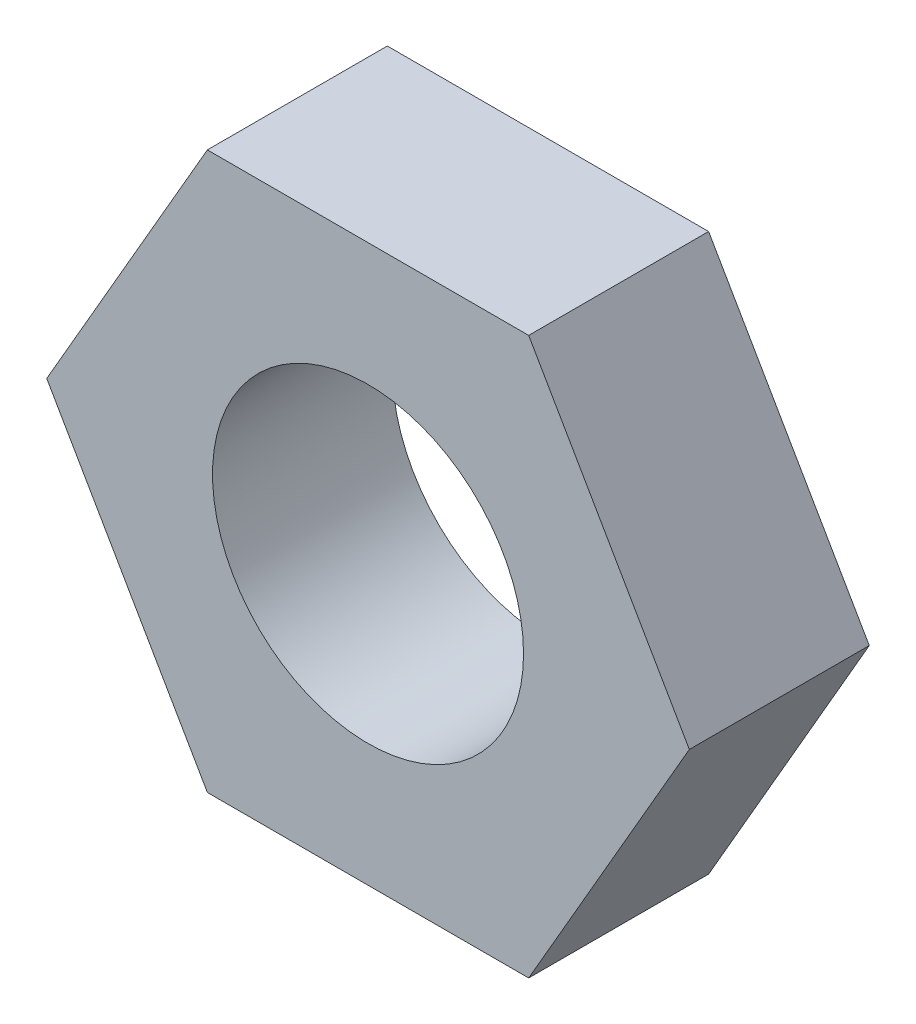
ISO-10303-21;
HEADER;
FILE_DESCRIPTION(('STEP AP214'),'2;1');
FILE_NAME('part.step','',(''),(''),'','','');
FILE_SCHEMA(('AUTOMOTIVE_DESIGN { 1 0 10303 214 1 1 1 1 }'));
ENDSEC;
DATA;
#1=APPLICATION_CONTEXT('core data for automotive mechanical design processes');
#2=APPLICATION_PROTOCOL_DEFINITION('international standard','automotive_design',2000,#1);
#3=PRODUCT_CONTEXT('',#1,'mechanical');
#4=PRODUCT('Part','Part','',(#3));
#5=PRODUCT_RELATED_PRODUCT_CATEGORY('part','',(#4));
#6=PRODUCT_DEFINITION_FORMATION('','',#4);
#7=PRODUCT_DEFINITION_CONTEXT('part definition',#1,'design');
#8=PRODUCT_DEFINITION('design','',#6,#7);
#9=PRODUCT_DEFINITION_SHAPE('','',#8);
#10=(LENGTH_UNIT() NAMED_UNIT(*) SI_UNIT(.MILLI.,.METRE.));
#11=(NAMED_UNIT(*) PLANE_ANGLE_UNIT() SI_UNIT($,.RADIAN.));
#12=(NAMED_UNIT(*) SI_UNIT($,.STERADIAN.) SOLID_ANGLE_UNIT());
#13=UNCERTAINTY_MEASURE_WITH_UNIT(LENGTH_MEASURE(1.E-05),#10,'distance_accuracy_value','');
#14=(GEOMETRIC_REPRESENTATION_CONTEXT(3) GLOBAL_UNCERTAINTY_ASSIGNED_CONTEXT((#13)) GLOBAL_UNIT_ASSIGNED_CONTEXT((#10,
#11,#12)) REPRESENTATION_CONTEXT('',''));
#15=CARTESIAN_POINT('',(0.,0.,0.));
#16=DIRECTION('',(0.,0.,1.));
#17=DIRECTION('',(1.,0.,0.));
#18=AXIS2_PLACEMENT_3D('',#15,#16,#17);
#19=CARTESIAN_POINT('',(0.,0.,7.));
#20=DIRECTION('',(0.,0.,1.));
#21=DIRECTION('',(1.,0.,0.));
#22=AXIS2_PLACEMENT_3D('',#19,#20,#21);
#23=PLANE('',#22);
#24=DIRECTION('',(0.499999999999995,0.866025403784442,0.));
#25=VECTOR('',#24,1.);
#26=CARTESIAN_POINT('',(6.25000000000013,-10.8253175473054,7.));
#27=LINE('',#26,#25);
#28=CARTESIAN_POINT('',(6.25000000000013,-10.8253175473054,7.));
#29=VERTEX_POINT('',#28);
#30=CARTESIAN_POINT('',(12.5,0.,7.));
#31=VERTEX_POINT('',#30);
#32=EDGE_CURVE('E128',#29,#31,#27,.T.);
#33=ORIENTED_EDGE('',*,*,#32,.T.);
#34=DIRECTION('',(-0.500000000000001,0.866025403784438,0.));
#35=VECTOR('',#34,1.);
#36=CARTESIAN_POINT('',(12.5,0.,7.));
#37=LINE('',#36,#35);
#38=CARTESIAN_POINT('',(6.24999999999998,10.8253175473055,7.));
#39=VERTEX_POINT('',#38);
#40=EDGE_CURVE('E86',#31,#39,#37,.T.);
#41=ORIENTED_EDGE('',*,*,#40,.T.);
#42=DIRECTION('',(-1.,0.,0.));
#43=VECTOR('',#42,1.);
#44=CARTESIAN_POINT('',(6.24999999999998,10.8253175473055,7.));
#45=LINE('',#44,#43);
#46=CARTESIAN_POINT('',(-6.25000000000005,10.8253175473055,7.));
#47=VERTEX_POINT('',#46);
#48=EDGE_CURVE('E99',#39,#47,#45,.T.);
#49=ORIENTED_EDGE('',*,*,#48,.T.);
#50=DIRECTION('',(-0.499999999999995,-0.866025403784442,0.));
#51=VECTOR('',#50,1.);
#52=CARTESIAN_POINT('',(-6.25000000000005,10.8253175473055,7.));
#53=LINE('',#52,#51);
#54=CARTESIAN_POINT('',(-12.5,0.,7.));
#55=VERTEX_POINT('',#54);
#56=EDGE_CURVE('E93',#47,#55,#53,.T.);
#57=ORIENTED_EDGE('',*,*,#56,.T.);
#58=DIRECTION('',(0.500000000000007,-0.866025403784435,0.));
#59=VECTOR('',#58,1.);
#60=CARTESIAN_POINT('',(-12.5,0.,7.));
#61=LINE('',#60,#59);
#62=CARTESIAN_POINT('',(-6.2499999999999,-10.8253175473055,7.));
#63=VERTEX_POINT('',#62);
#64=EDGE_CURVE('E97',#55,#63,#61,.T.);
#65=ORIENTED_EDGE('',*,*,#64,.T.);
#66=DIRECTION('',(1.,0.,0.));
#67=VECTOR('',#66,1.);
#68=CARTESIAN_POINT('',(-6.2499999999999,-10.8253175473055,7.));
#69=LINE('',#68,#67);
#70=EDGE_CURVE('E49',#63,#29,#69,.T.);
#71=ORIENTED_EDGE('',*,*,#70,.T.);
#72=EDGE_LOOP('',(#33,#41,#49,#57,#65,#71));
#73=FACE_BOUND('',#72,.T.);
#74=CARTESIAN_POINT('',(0.,0.,7.));
#75=DIRECTION('',(0.,0.,1.));
#76=DIRECTION('',(1.,0.,0.));
#77=AXIS2_PLACEMENT_3D('',#74,#75,#76);
#78=CIRCLE('',#77,6.05);
#79=CARTESIAN_POINT('',(6.05,0.,7.));
#80=VERTEX_POINT('',#79);
#81=EDGE_CURVE('E121',#80,#80,#78,.T.);
#82=ORIENTED_EDGE('',*,*,#81,.F.);
#83=EDGE_LOOP('',(#82));
#84=FACE_BOUND('',#83,.T.);
#85=ADVANCED_FACE('F32',(#73,#84),#23,.T.);
#86=CARTESIAN_POINT('',(0.,0.,0.));
#87=DIRECTION('',(0.,0.,1.));
#88=DIRECTION('',(1.,0.,0.));
#89=AXIS2_PLACEMENT_3D('',#86,#87,#88);
#90=PLANE('',#89);
#91=DIRECTION('',(0.499999999999995,0.866025403784442,0.));
#92=VECTOR('',#91,1.);
#93=CARTESIAN_POINT('',(6.25000000000013,-10.8253175473054,0.));
#94=LINE('',#93,#92);
#95=CARTESIAN_POINT('',(6.25000000000013,-10.8253175473054,0.));
#96=VERTEX_POINT('',#95);
#97=CARTESIAN_POINT('',(12.5,0.,0.));
#98=VERTEX_POINT('',#97);
#99=EDGE_CURVE('E117',#96,#98,#94,.T.);
#100=ORIENTED_EDGE('',*,*,#99,.F.);
#101=DIRECTION('',(1.,0.,0.));
#102=VECTOR('',#101,1.);
#103=CARTESIAN_POINT('',(-6.2499999999999,-10.8253175473055,0.));
#104=LINE('',#103,#102);
#105=CARTESIAN_POINT('',(-6.2499999999999,-10.8253175473055,0.));
#106=VERTEX_POINT('',#105);
#107=EDGE_CURVE('E78',#106,#96,#104,.T.);
#108=ORIENTED_EDGE('',*,*,#107,.F.);
#109=DIRECTION('',(0.500000000000007,-0.866025403784435,0.));
#110=VECTOR('',#109,1.);
#111=CARTESIAN_POINT('',(-12.5,0.,0.));
#112=LINE('',#111,#110);
#113=CARTESIAN_POINT('',(-12.5,0.,0.));
#114=VERTEX_POINT('',#113);
#115=EDGE_CURVE('E72',#114,#106,#112,.T.);
#116=ORIENTED_EDGE('',*,*,#115,.F.);
#117=DIRECTION('',(-0.499999999999995,-0.866025403784442,0.));
#118=VECTOR('',#117,1.);
#119=CARTESIAN_POINT('',(-6.25000000000005,10.8253175473055,0.));
#120=LINE('',#119,#118);
#121=CARTESIAN_POINT('',(-6.25000000000005,10.8253175473055,0.));
#122=VERTEX_POINT('',#121);
#123=EDGE_CURVE('E107',#122,#114,#120,.T.);
#124=ORIENTED_EDGE('',*,*,#123,.F.);
#125=DIRECTION('',(-1.,0.,0.));
#126=VECTOR('',#125,1.);
#127=CARTESIAN_POINT('',(6.24999999999998,10.8253175473055,0.));
#128=LINE('',#127,#126);
#129=CARTESIAN_POINT('',(6.24999999999998,10.8253175473055,0.));
#130=VERTEX_POINT('',#129);
#131=EDGE_CURVE('E123',#130,#122,#128,.T.);
#132=ORIENTED_EDGE('',*,*,#131,.F.);
#133=DIRECTION('',(-0.500000000000001,0.866025403784438,0.));
#134=VECTOR('',#133,1.);
#135=CARTESIAN_POINT('',(12.5,0.,0.));
#136=LINE('',#135,#134);
#137=EDGE_CURVE('E120',#98,#130,#136,.T.);
#138=ORIENTED_EDGE('',*,*,#137,.F.);
#139=EDGE_LOOP('',(#100,#108,#116,#124,#132,#138));
#140=FACE_BOUND('',#139,.T.);
#141=CARTESIAN_POINT('',(0.,0.,0.));
#142=DIRECTION('',(0.,0.,1.));
#143=DIRECTION('',(1.,0.,0.));
#144=AXIS2_PLACEMENT_3D('',#141,#142,#143);
#145=CIRCLE('',#144,6.05);
#146=CARTESIAN_POINT('',(6.05,0.,0.));
#147=VERTEX_POINT('',#146);
#148=EDGE_CURVE('E221',#147,#147,#145,.T.);
#149=ORIENTED_EDGE('',*,*,#148,.T.);
#150=EDGE_LOOP('',(#149));
#151=FACE_BOUND('',#150,.T.);
#152=ADVANCED_FACE('F137',(#140,#151),#90,.F.);
#153=CARTESIAN_POINT('',(6.25000000000013,-10.8253175473054,7.));
#154=DIRECTION('',(-0.866025403784442,0.499999999999995,0.));
#155=DIRECTION('',(-0.499999999999995,-0.866025403784442,0.));
#156=AXIS2_PLACEMENT_3D('',#153,#154,#155);
#157=PLANE('',#156);
#158=ORIENTED_EDGE('',*,*,#99,.T.);
#159=DIRECTION('',(0.,0.,-1.));
#160=VECTOR('',#159,1.);
#161=CARTESIAN_POINT('',(12.5,0.,7.));
#162=LINE('',#161,#160);
#163=EDGE_CURVE('E11',#31,#98,#162,.T.);
#164=ORIENTED_EDGE('',*,*,#163,.F.);
#165=ORIENTED_EDGE('',*,*,#32,.F.);
#166=DIRECTION('',(0.,0.,-1.));
#167=VECTOR('',#166,1.);
#168=CARTESIAN_POINT('',(6.25000000000013,-10.8253175473054,7.));
#169=LINE('',#168,#167);
#170=EDGE_CURVE('E113',#29,#96,#169,.T.);
#171=ORIENTED_EDGE('',*,*,#170,.T.);
#172=EDGE_LOOP('',(#158,#164,#165,#171));
#173=FACE_BOUND('',#172,.T.);
#174=ADVANCED_FACE('F34',(#173),#157,.F.);
#175=CARTESIAN_POINT('',(12.5,0.,7.));
#176=DIRECTION('',(-0.866025403784438,-0.500000000000001,0.));
#177=DIRECTION('',(0.500000000000001,-0.866025403784438,0.));
#178=AXIS2_PLACEMENT_3D('',#175,#176,#177);
#179=PLANE('',#178);
#180=ORIENTED_EDGE('',*,*,#137,.T.);
#181=DIRECTION('',(0.,0.,-1.));
#182=VECTOR('',#181,1.);
#183=CARTESIAN_POINT('',(6.24999999999998,10.8253175473055,7.));
#184=LINE('',#183,#182);
#185=EDGE_CURVE('E41',#39,#130,#184,.T.);
#186=ORIENTED_EDGE('',*,*,#185,.F.);
#187=ORIENTED_EDGE('',*,*,#40,.F.);
#188=ORIENTED_EDGE('',*,*,#163,.T.);
#189=EDGE_LOOP('',(#180,#186,#187,#188));
#190=FACE_BOUND('',#189,.T.);
#191=ADVANCED_FACE('F162',(#190),#179,.F.);
#192=CARTESIAN_POINT('',(6.24999999999998,10.8253175473055,7.));
#193=DIRECTION('',(0.,-1.,0.));
#194=DIRECTION('',(1.,0.,0.));
#195=AXIS2_PLACEMENT_3D('',#192,#193,#194);
#196=PLANE('',#195);
#197=ORIENTED_EDGE('',*,*,#131,.T.);
#198=DIRECTION('',(0.,0.,-1.));
#199=VECTOR('',#198,1.);
#200=CARTESIAN_POINT('',(-6.25000000000005,10.8253175473055,7.));
#201=LINE('',#200,#199);
#202=EDGE_CURVE('E108',#47,#122,#201,.T.);
#203=ORIENTED_EDGE('',*,*,#202,.F.);
#204=ORIENTED_EDGE('',*,*,#48,.F.);
#205=ORIENTED_EDGE('',*,*,#185,.T.);
#206=EDGE_LOOP('',(#197,#203,#204,#205));
#207=FACE_BOUND('',#206,.T.);
#208=ADVANCED_FACE('F134',(#207),#196,.F.);
#209=CARTESIAN_POINT('',(-6.25000000000005,10.8253175473055,7.));
#210=DIRECTION('',(0.866025403784442,-0.499999999999995,0.));
#211=DIRECTION('',(0.499999999999995,0.866025403784442,0.));
#212=AXIS2_PLACEMENT_3D('',#209,#210,#211);
#213=PLANE('',#212);
#214=ORIENTED_EDGE('',*,*,#123,.T.);
#215=DIRECTION('',(0.,0.,-1.));
#216=VECTOR('',#215,1.);
#217=CARTESIAN_POINT('',(-12.5,0.,7.));
#218=LINE('',#217,#216);
#219=EDGE_CURVE('E104',#55,#114,#218,.T.);
#220=ORIENTED_EDGE('',*,*,#219,.F.);
#221=ORIENTED_EDGE('',*,*,#56,.F.);
#222=ORIENTED_EDGE('',*,*,#202,.T.);
#223=EDGE_LOOP('',(#214,#220,#221,#222));
#224=FACE_BOUND('',#223,.T.);
#225=ADVANCED_FACE('F105',(#224),#213,.F.);
#226=CARTESIAN_POINT('',(-12.5,0.,7.));
#227=DIRECTION('',(0.866025403784435,0.500000000000007,0.));
#228=DIRECTION('',(-0.500000000000007,0.866025403784435,0.));
#229=AXIS2_PLACEMENT_3D('',#226,#227,#228);
#230=PLANE('',#229);
#231=ORIENTED_EDGE('',*,*,#115,.T.);
#232=DIRECTION('',(0.,0.,-1.));
#233=VECTOR('',#232,1.);
#234=CARTESIAN_POINT('',(-6.2499999999999,-10.8253175473055,7.));
#235=LINE('',#234,#233);
#236=EDGE_CURVE('E109',#63,#106,#235,.T.);
#237=ORIENTED_EDGE('',*,*,#236,.F.);
#238=ORIENTED_EDGE('',*,*,#64,.F.);
#239=ORIENTED_EDGE('',*,*,#219,.T.);
#240=EDGE_LOOP('',(#231,#237,#238,#239));
#241=FACE_BOUND('',#240,.T.);
#242=ADVANCED_FACE('F111',(#241),#230,.F.);
#243=CARTESIAN_POINT('',(-6.2499999999999,-10.8253175473055,7.));
#244=DIRECTION('',(0.,1.,0.));
#245=DIRECTION('',(-1.,0.,0.));
#246=AXIS2_PLACEMENT_3D('',#243,#244,#245);
#247=PLANE('',#246);
#248=ORIENTED_EDGE('',*,*,#107,.T.);
#249=ORIENTED_EDGE('',*,*,#170,.F.);
#250=ORIENTED_EDGE('',*,*,#70,.F.);
#251=ORIENTED_EDGE('',*,*,#236,.T.);
#252=EDGE_LOOP('',(#248,#249,#250,#251));
#253=FACE_BOUND('',#252,.T.);
#254=ADVANCED_FACE('F142',(#253),#247,.F.);
#255=CARTESIAN_POINT('',(0.,0.,7.));
#256=DIRECTION('',(0.,0.,-1.));
#257=DIRECTION('',(-1.,0.,0.));
#258=AXIS2_PLACEMENT_3D('',#255,#256,#257);
#259=CYLINDRICAL_SURFACE('',#258,6.05);
#260=ORIENTED_EDGE('',*,*,#81,.T.);
#261=EDGE_LOOP('',(#260));
#262=FACE_BOUND('',#261,.T.);
#263=ORIENTED_EDGE('',*,*,#148,.F.);
#264=EDGE_LOOP('',(#263));
#265=FACE_BOUND('',#264,.T.);
#266=ADVANCED_FACE('F144',(#262,#265),#259,.F.);
#267=CLOSED_SHELL('',(#85,#152,#174,#191,#208,#225,#242,#254,#266));
#268=MANIFOLD_SOLID_BREP('B2',#267);
#269=ADVANCED_BREP_SHAPE_REPRESENTATION('',(#18,#268),#14);
#270=SHAPE_DEFINITION_REPRESENTATION(#9,#269);
ENDSEC;
END-ISO-10303-21;
